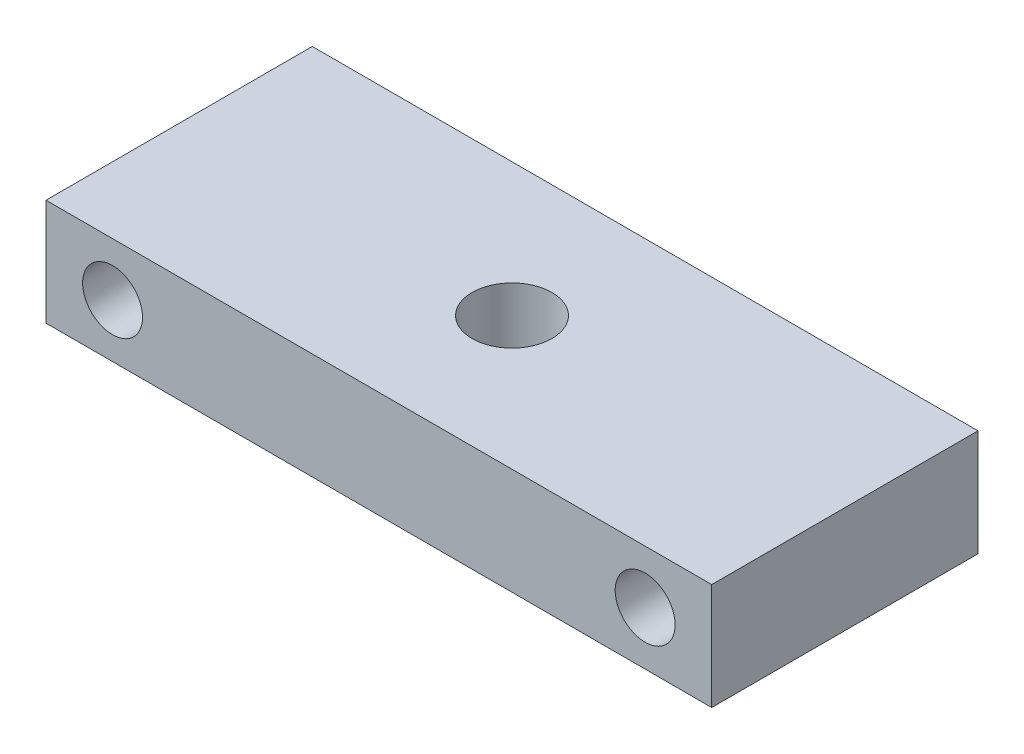
ISO-10303-21;
HEADER;
FILE_DESCRIPTION(('STEP AP214'),'2;1');
FILE_NAME('part.step','',(''),(''),'','','');
FILE_SCHEMA(('AUTOMOTIVE_DESIGN { 1 0 10303 214 1 1 1 1 }'));
ENDSEC;
DATA;
#1=APPLICATION_CONTEXT('core data for automotive mechanical design processes');
#2=APPLICATION_PROTOCOL_DEFINITION('international standard','automotive_design',2000,#1);
#3=PRODUCT_CONTEXT('',#1,'mechanical');
#4=PRODUCT('Part','Part','',(#3));
#5=PRODUCT_RELATED_PRODUCT_CATEGORY('part','',(#4));
#6=PRODUCT_DEFINITION_FORMATION('','',#4);
#7=PRODUCT_DEFINITION_CONTEXT('part definition',#1,'design');
#8=PRODUCT_DEFINITION('design','',#6,#7);
#9=PRODUCT_DEFINITION_SHAPE('','',#8);
#10=(LENGTH_UNIT() NAMED_UNIT(*) SI_UNIT(.MILLI.,.METRE.));
#11=(NAMED_UNIT(*) PLANE_ANGLE_UNIT() SI_UNIT($,.RADIAN.));
#12=(NAMED_UNIT(*) SI_UNIT($,.STERADIAN.) SOLID_ANGLE_UNIT());
#13=UNCERTAINTY_MEASURE_WITH_UNIT(LENGTH_MEASURE(1.E-05),#10,'distance_accuracy_value','');
#14=(GEOMETRIC_REPRESENTATION_CONTEXT(3) GLOBAL_UNCERTAINTY_ASSIGNED_CONTEXT((#13)) GLOBAL_UNIT_ASSIGNED_CONTEXT((#10,
#11,#12)) REPRESENTATION_CONTEXT('',''));
#15=CARTESIAN_POINT('',(0.,0.,0.));
#16=DIRECTION('',(0.,0.,1.));
#17=DIRECTION('',(1.,0.,0.));
#18=AXIS2_PLACEMENT_3D('',#15,#16,#17);
#19=CARTESIAN_POINT('',(5.,4.0021,0.001600000000053));
#20=DIRECTION('',(0.,0.,1.));
#21=DIRECTION('',(1.,0.,0.));
#22=AXIS2_PLACEMENT_3D('',#19,#20,#21);
#23=CYLINDRICAL_SURFACE('',#22,2.25);
#24=CARTESIAN_POINT('',(5.,4.0021,0.001600000000053));
#25=DIRECTION('',(0.,0.,1.));
#26=DIRECTION('',(1.,0.,0.));
#27=AXIS2_PLACEMENT_3D('',#24,#25,#26);
#28=CIRCLE('',#27,2.25);
#29=CARTESIAN_POINT('',(7.25,4.0021,0.001600000000053));
#30=VERTEX_POINT('',#29);
#31=EDGE_CURVE('E19',#30,#30,#28,.F.);
#32=ORIENTED_EDGE('',*,*,#31,.T.);
#33=EDGE_LOOP('',(#32));
#34=FACE_BOUND('',#33,.T.);
#35=CARTESIAN_POINT('',(5.,4.0021,20.0016));
#36=DIRECTION('',(0.,0.,1.));
#37=DIRECTION('',(1.,0.,0.));
#38=AXIS2_PLACEMENT_3D('',#35,#36,#37);
#39=CIRCLE('',#38,2.25);
#40=CARTESIAN_POINT('',(7.25,4.0021,20.0016));
#41=VERTEX_POINT('',#40);
#42=EDGE_CURVE('E86',#41,#41,#39,.F.);
#43=ORIENTED_EDGE('',*,*,#42,.F.);
#44=EDGE_LOOP('',(#43));
#45=FACE_BOUND('',#44,.T.);
#46=ADVANCED_FACE('F16',(#34,#45),#23,.F.);
#47=CARTESIAN_POINT('',(45.,4.0021,0.001600000000053));
#48=DIRECTION('',(0.,0.,1.));
#49=DIRECTION('',(1.,0.,0.));
#50=AXIS2_PLACEMENT_3D('',#47,#48,#49);
#51=CYLINDRICAL_SURFACE('',#50,2.25);
#52=CARTESIAN_POINT('',(45.,4.0021,0.001600000000053));
#53=DIRECTION('',(0.,0.,1.));
#54=DIRECTION('',(1.,0.,0.));
#55=AXIS2_PLACEMENT_3D('',#52,#53,#54);
#56=CIRCLE('',#55,2.25);
#57=CARTESIAN_POINT('',(47.25,4.0021,0.001600000000053));
#58=VERTEX_POINT('',#57);
#59=EDGE_CURVE('E88',#58,#58,#56,.F.);
#60=ORIENTED_EDGE('',*,*,#59,.T.);
#61=EDGE_LOOP('',(#60));
#62=FACE_BOUND('',#61,.T.);
#63=CARTESIAN_POINT('',(45.,4.0021,20.0016));
#64=DIRECTION('',(0.,0.,1.));
#65=DIRECTION('',(1.,0.,0.));
#66=AXIS2_PLACEMENT_3D('',#63,#64,#65);
#67=CIRCLE('',#66,2.25);
#68=CARTESIAN_POINT('',(47.25,4.0021,20.0016));
#69=VERTEX_POINT('',#68);
#70=EDGE_CURVE('E83',#69,#69,#67,.F.);
#71=ORIENTED_EDGE('',*,*,#70,.F.);
#72=EDGE_LOOP('',(#71));
#73=FACE_BOUND('',#72,.T.);
#74=ADVANCED_FACE('F145',(#62,#73),#51,.F.);
#75=CARTESIAN_POINT('',(0.,0.002099999999984,0.001600000000053));
#76=DIRECTION('',(0.,-1.,0.));
#77=DIRECTION('',(0.,0.,-1.));
#78=AXIS2_PLACEMENT_3D('',#75,#76,#77);
#79=PLANE('',#78);
#80=CARTESIAN_POINT('',(25.,0.00209999999999967,10.0016));
#81=DIRECTION('',(0.,-1.,0.));
#82=DIRECTION('',(0.,0.,-1.));
#83=AXIS2_PLACEMENT_3D('',#80,#81,#82);
#84=CIRCLE('',#83,3.);
#85=CARTESIAN_POINT('',(25.,0.00209999999999967,7.0016));
#86=VERTEX_POINT('',#85);
#87=EDGE_CURVE('E80',#86,#86,#84,.F.);
#88=ORIENTED_EDGE('',*,*,#87,.T.);
#89=EDGE_LOOP('',(#88));
#90=FACE_BOUND('',#89,.T.);
#91=DIRECTION('',(0.,0.,-1.));
#92=VECTOR('',#91,1.);
#93=CARTESIAN_POINT('',(50.,0.00209999999999967,0.001600000000053));
#94=LINE('',#93,#92);
#95=CARTESIAN_POINT('',(50.,0.00209999999999184,20.0016));
#96=VERTEX_POINT('',#95);
#97=CARTESIAN_POINT('',(50.,0.00209999999999575,0.001600000000053));
#98=VERTEX_POINT('',#97);
#99=EDGE_CURVE('E92',#96,#98,#94,.T.);
#100=ORIENTED_EDGE('',*,*,#99,.F.);
#101=DIRECTION('',(1.,0.,0.));
#102=VECTOR('',#101,1.);
#103=CARTESIAN_POINT('',(0.,0.00209999999999967,20.0016));
#104=LINE('',#103,#102);
#105=CARTESIAN_POINT('',(0.,0.00209999999999575,20.0016));
#106=VERTEX_POINT('',#105);
#107=EDGE_CURVE('E60',#106,#96,#104,.T.);
#108=ORIENTED_EDGE('',*,*,#107,.F.);
#109=DIRECTION('',(0.,0.,-1.));
#110=VECTOR('',#109,1.);
#111=CARTESIAN_POINT('',(0.,0.00209999999999967,0.001600000000053));
#112=LINE('',#111,#110);
#113=CARTESIAN_POINT('',(0.,0.00209999999999575,0.001600000000053));
#114=VERTEX_POINT('',#113);
#115=EDGE_CURVE('E58',#106,#114,#112,.T.);
#116=ORIENTED_EDGE('',*,*,#115,.T.);
#117=DIRECTION('',(1.,0.,0.));
#118=VECTOR('',#117,1.);
#119=CARTESIAN_POINT('',(0.,0.00209999999999967,0.001600000000053));
#120=LINE('',#119,#118);
#121=EDGE_CURVE('E55',#114,#98,#120,.T.);
#122=ORIENTED_EDGE('',*,*,#121,.T.);
#123=EDGE_LOOP('',(#100,#108,#116,#122));
#124=FACE_BOUND('',#123,.T.);
#125=ADVANCED_FACE('F59',(#90,#124),#79,.T.);
#126=CARTESIAN_POINT('',(0.,8.0021,0.001600000000053));
#127=DIRECTION('',(1.,0.,0.));
#128=DIRECTION('',(0.,0.,-1.));
#129=AXIS2_PLACEMENT_3D('',#126,#127,#128);
#130=PLANE('',#129);
#131=DIRECTION('',(0.,1.,0.));
#132=VECTOR('',#131,1.);
#133=CARTESIAN_POINT('',(0.,8.0021,20.0016));
#134=LINE('',#133,#132);
#135=CARTESIAN_POINT('',(0.,8.0021,20.0016));
#136=VERTEX_POINT('',#135);
#137=EDGE_CURVE('E131',#136,#106,#134,.F.);
#138=ORIENTED_EDGE('',*,*,#137,.F.);
#139=DIRECTION('',(0.,0.,-1.));
#140=VECTOR('',#139,1.);
#141=CARTESIAN_POINT('',(0.,8.0021,0.001600000000053));
#142=LINE('',#141,#140);
#143=CARTESIAN_POINT('',(0.,8.0021,0.001600000000053));
#144=VERTEX_POINT('',#143);
#145=EDGE_CURVE('E76',#136,#144,#142,.T.);
#146=ORIENTED_EDGE('',*,*,#145,.T.);
#147=DIRECTION('',(0.,1.,0.));
#148=VECTOR('',#147,1.);
#149=CARTESIAN_POINT('',(0.,8.0021,0.001600000000053));
#150=LINE('',#149,#148);
#151=EDGE_CURVE('E65',#144,#114,#150,.F.);
#152=ORIENTED_EDGE('',*,*,#151,.T.);
#153=ORIENTED_EDGE('',*,*,#115,.F.);
#154=EDGE_LOOP('',(#138,#146,#152,#153));
#155=FACE_BOUND('',#154,.T.);
#156=ADVANCED_FACE('F75',(#155),#130,.F.);
#157=CARTESIAN_POINT('',(0.,8.0021,0.001600000000053));
#158=DIRECTION('',(0.,0.,1.));
#159=DIRECTION('',(1.,0.,0.));
#160=AXIS2_PLACEMENT_3D('',#157,#158,#159);
#161=PLANE('',#160);
#162=ORIENTED_EDGE('',*,*,#59,.F.);
#163=EDGE_LOOP('',(#162));
#164=FACE_BOUND('',#163,.T.);
#165=ORIENTED_EDGE('',*,*,#31,.F.);
#166=EDGE_LOOP('',(#165));
#167=FACE_BOUND('',#166,.T.);
#168=ORIENTED_EDGE('',*,*,#121,.F.);
#169=ORIENTED_EDGE('',*,*,#151,.F.);
#170=DIRECTION('',(1.,0.,0.));
#171=VECTOR('',#170,1.);
#172=CARTESIAN_POINT('',(0.,8.0021,0.001600000000053));
#173=LINE('',#172,#171);
#174=CARTESIAN_POINT('',(50.,8.0021,0.001600000000053));
#175=VERTEX_POINT('',#174);
#176=EDGE_CURVE('E141',#144,#175,#173,.T.);
#177=ORIENTED_EDGE('',*,*,#176,.T.);
#178=DIRECTION('',(0.,1.,0.));
#179=VECTOR('',#178,1.);
#180=CARTESIAN_POINT('',(50.,8.0021,0.001600000000053));
#181=LINE('',#180,#179);
#182=EDGE_CURVE('E72',#98,#175,#181,.T.);
#183=ORIENTED_EDGE('',*,*,#182,.F.);
#184=EDGE_LOOP('',(#168,#169,#177,#183));
#185=FACE_BOUND('',#184,.T.);
#186=ADVANCED_FACE('F69',(#164,#167,#185),#161,.F.);
#187=CARTESIAN_POINT('',(50.,8.0021,0.001600000000053));
#188=DIRECTION('',(1.,0.,0.));
#189=DIRECTION('',(0.,0.,-1.));
#190=AXIS2_PLACEMENT_3D('',#187,#188,#189);
#191=PLANE('',#190);
#192=DIRECTION('',(0.,1.,0.));
#193=VECTOR('',#192,1.);
#194=CARTESIAN_POINT('',(50.,8.0021,20.0016));
#195=LINE('',#194,#193);
#196=CARTESIAN_POINT('',(50.,8.0021,20.0016));
#197=VERTEX_POINT('',#196);
#198=EDGE_CURVE('E34',#96,#197,#195,.T.);
#199=ORIENTED_EDGE('',*,*,#198,.F.);
#200=ORIENTED_EDGE('',*,*,#99,.T.);
#201=ORIENTED_EDGE('',*,*,#182,.T.);
#202=DIRECTION('',(0.,0.,-1.));
#203=VECTOR('',#202,1.);
#204=CARTESIAN_POINT('',(50.,8.0021,0.001600000000053));
#205=LINE('',#204,#203);
#206=EDGE_CURVE('E136',#175,#197,#205,.F.);
#207=ORIENTED_EDGE('',*,*,#206,.T.);
#208=EDGE_LOOP('',(#199,#200,#201,#207));
#209=FACE_BOUND('',#208,.T.);
#210=ADVANCED_FACE('F99',(#209),#191,.T.);
#211=CARTESIAN_POINT('',(0.,8.0021,20.0016));
#212=DIRECTION('',(0.,0.,1.));
#213=DIRECTION('',(1.,0.,0.));
#214=AXIS2_PLACEMENT_3D('',#211,#212,#213);
#215=PLANE('',#214);
#216=ORIENTED_EDGE('',*,*,#70,.T.);
#217=EDGE_LOOP('',(#216));
#218=FACE_BOUND('',#217,.T.);
#219=ORIENTED_EDGE('',*,*,#42,.T.);
#220=EDGE_LOOP('',(#219));
#221=FACE_BOUND('',#220,.T.);
#222=ORIENTED_EDGE('',*,*,#107,.T.);
#223=ORIENTED_EDGE('',*,*,#198,.T.);
#224=DIRECTION('',(1.,0.,0.));
#225=VECTOR('',#224,1.);
#226=CARTESIAN_POINT('',(0.,8.0021,20.0016));
#227=LINE('',#226,#225);
#228=EDGE_CURVE('E25',#197,#136,#227,.F.);
#229=ORIENTED_EDGE('',*,*,#228,.T.);
#230=ORIENTED_EDGE('',*,*,#137,.T.);
#231=EDGE_LOOP('',(#222,#223,#229,#230));
#232=FACE_BOUND('',#231,.T.);
#233=ADVANCED_FACE('F107',(#218,#221,#232),#215,.T.);
#234=CARTESIAN_POINT('',(25.,8.0021,10.0016));
#235=DIRECTION('',(0.,-1.,0.));
#236=DIRECTION('',(0.,0.,-1.));
#237=AXIS2_PLACEMENT_3D('',#234,#235,#236);
#238=CYLINDRICAL_SURFACE('',#237,3.);
#239=CARTESIAN_POINT('',(25.,8.0021,10.0016));
#240=DIRECTION('',(0.,-1.,0.));
#241=DIRECTION('',(0.,0.,-1.));
#242=AXIS2_PLACEMENT_3D('',#239,#240,#241);
#243=CIRCLE('',#242,3.);
#244=CARTESIAN_POINT('',(25.,8.0021,7.0016));
#245=VERTEX_POINT('',#244);
#246=EDGE_CURVE('E11',#245,#245,#243,.F.);
#247=ORIENTED_EDGE('',*,*,#246,.T.);
#248=EDGE_LOOP('',(#247));
#249=FACE_BOUND('',#248,.T.);
#250=ORIENTED_EDGE('',*,*,#87,.F.);
#251=EDGE_LOOP('',(#250));
#252=FACE_BOUND('',#251,.T.);
#253=ADVANCED_FACE('F113',(#249,#252),#238,.F.);
#254=CARTESIAN_POINT('',(0.,8.0021,0.001600000000053));
#255=DIRECTION('',(0.,-1.,0.));
#256=DIRECTION('',(0.,0.,-1.));
#257=AXIS2_PLACEMENT_3D('',#254,#255,#256);
#258=PLANE('',#257);
#259=ORIENTED_EDGE('',*,*,#246,.F.);
#260=EDGE_LOOP('',(#259));
#261=FACE_BOUND('',#260,.T.);
#262=ORIENTED_EDGE('',*,*,#206,.F.);
#263=ORIENTED_EDGE('',*,*,#176,.F.);
#264=ORIENTED_EDGE('',*,*,#145,.F.);
#265=ORIENTED_EDGE('',*,*,#228,.F.);
#266=EDGE_LOOP('',(#262,#263,#264,#265));
#267=FACE_BOUND('',#266,.T.);
#268=ADVANCED_FACE('F111',(#261,#267),#258,.F.);
#269=CLOSED_SHELL('',(#46,#74,#125,#156,#186,#210,#233,#253,#268));
#270=MANIFOLD_SOLID_BREP('B1',#269);
#271=ADVANCED_BREP_SHAPE_REPRESENTATION('',(#18,#270),#14);
#272=SHAPE_DEFINITION_REPRESENTATION(#9,#271);
ENDSEC;
END-ISO-10303-21;
